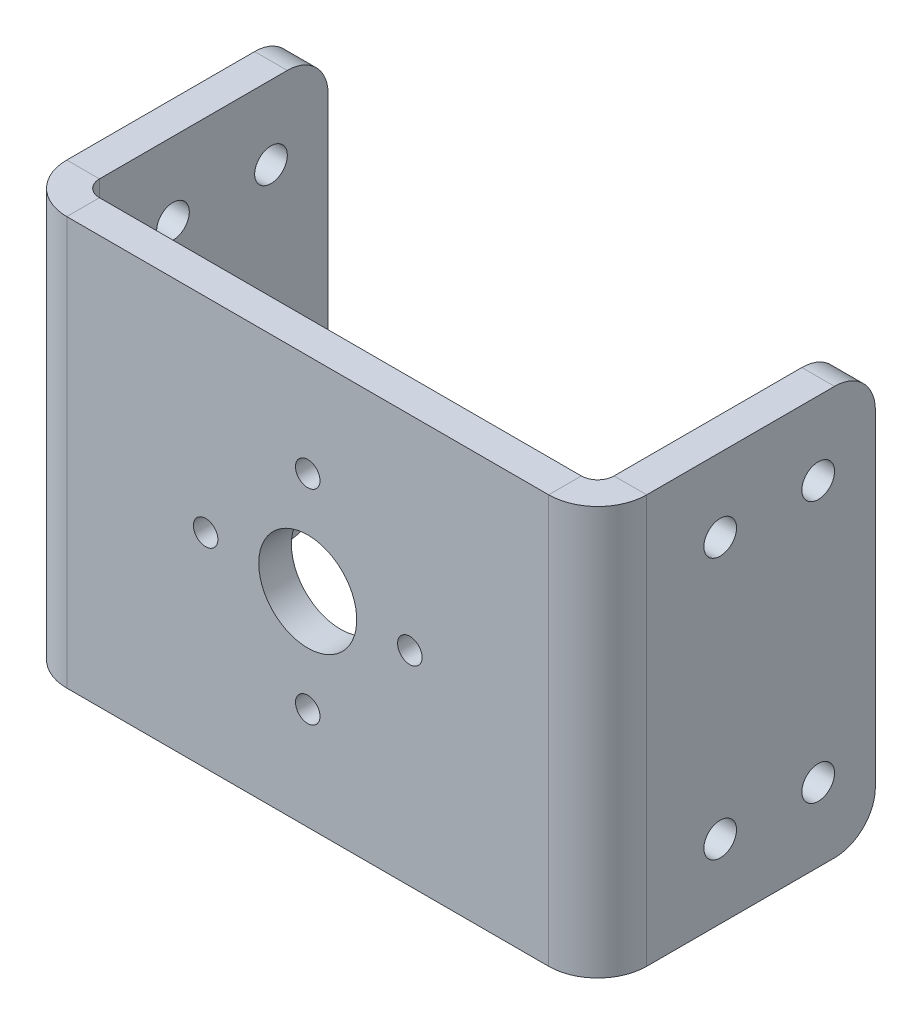
ISO-10303-21;
HEADER;
FILE_DESCRIPTION(('STEP AP214'),'2;1');
FILE_NAME('part.step','',(''),(''),'','','');
FILE_SCHEMA(('AUTOMOTIVE_DESIGN { 1 0 10303 214 1 1 1 1 }'));
ENDSEC;
DATA;
#1=APPLICATION_CONTEXT('core data for automotive mechanical design processes');
#2=APPLICATION_PROTOCOL_DEFINITION('international standard','automotive_design',2000,#1);
#3=PRODUCT_CONTEXT('',#1,'mechanical');
#4=PRODUCT('Part','Part','',(#3));
#5=PRODUCT_RELATED_PRODUCT_CATEGORY('part','',(#4));
#6=PRODUCT_DEFINITION_FORMATION('','',#4);
#7=PRODUCT_DEFINITION_CONTEXT('part definition',#1,'design');
#8=PRODUCT_DEFINITION('design','',#6,#7);
#9=PRODUCT_DEFINITION_SHAPE('','',#8);
#10=(LENGTH_UNIT() NAMED_UNIT(*) SI_UNIT(.MILLI.,.METRE.));
#11=(NAMED_UNIT(*) PLANE_ANGLE_UNIT() SI_UNIT($,.RADIAN.));
#12=(NAMED_UNIT(*) SI_UNIT($,.STERADIAN.) SOLID_ANGLE_UNIT());
#13=UNCERTAINTY_MEASURE_WITH_UNIT(LENGTH_MEASURE(1.E-05),#10,'distance_accuracy_value','');
#14=(GEOMETRIC_REPRESENTATION_CONTEXT(3) GLOBAL_UNCERTAINTY_ASSIGNED_CONTEXT((#13)) GLOBAL_UNIT_ASSIGNED_CONTEXT((#10,
#11,#12)) REPRESENTATION_CONTEXT('',''));
#15=CARTESIAN_POINT('',(0.,0.,0.));
#16=DIRECTION('',(0.,0.,1.));
#17=DIRECTION('',(1.,0.,0.));
#18=AXIS2_PLACEMENT_3D('',#15,#16,#17);
#19=CARTESIAN_POINT('',(-35.5,50.,-6.));
#20=DIRECTION('',(0.,1.,0.));
#21=DIRECTION('',(0.,0.,1.));
#22=AXIS2_PLACEMENT_3D('',#19,#20,#21);
#23=PLANE('',#22);
#24=DIRECTION('',(1.,0.,0.));
#25=VECTOR('',#24,1.);
#26=CARTESIAN_POINT('',(-35.5,50.,-6.));
#27=LINE('',#26,#25);
#28=CARTESIAN_POINT('',(-35.5,50.,-6.));
#29=VERTEX_POINT('',#28);
#30=CARTESIAN_POINT('',(-31.5,50.,-6.));
#31=VERTEX_POINT('',#30);
#32=EDGE_CURVE('E268',#29,#31,#27,.T.);
#33=ORIENTED_EDGE('',*,*,#32,.F.);
#34=CARTESIAN_POINT('',(-29.5,50.,-6.));
#35=DIRECTION('',(0.,1.,0.));
#36=DIRECTION('',(0.,0.,1.));
#37=AXIS2_PLACEMENT_3D('',#34,#35,#36);
#38=CIRCLE('',#37,6.);
#39=CARTESIAN_POINT('',(-29.5,50.,0.));
#40=VERTEX_POINT('',#39);
#41=EDGE_CURVE('E195',#29,#40,#38,.T.);
#42=ORIENTED_EDGE('',*,*,#41,.T.);
#43=DIRECTION('',(0.,0.,1.));
#44=VECTOR('',#43,1.);
#45=CARTESIAN_POINT('',(-29.5,50.,-4.));
#46=LINE('',#45,#44);
#47=CARTESIAN_POINT('',(-29.5,50.,-4.));
#48=VERTEX_POINT('',#47);
#49=EDGE_CURVE('E266',#48,#40,#46,.T.);
#50=ORIENTED_EDGE('',*,*,#49,.F.);
#51=CARTESIAN_POINT('',(-29.5,50.,-6.));
#52=DIRECTION('',(0.,1.,0.));
#53=DIRECTION('',(1.,0.,0.));
#54=AXIS2_PLACEMENT_3D('',#51,#52,#53);
#55=CIRCLE('',#54,2.);
#56=EDGE_CURVE('E185',#31,#48,#55,.T.);
#57=ORIENTED_EDGE('',*,*,#56,.F.);
#58=EDGE_LOOP('',(#33,#42,#50,#57));
#59=FACE_BOUND('',#58,.T.);
#60=ADVANCED_FACE('F36',(#59),#23,.T.);
#61=CARTESIAN_POINT('',(-29.5,50.,-4.));
#62=DIRECTION('',(0.,1.,0.));
#63=DIRECTION('',(0.,0.,1.));
#64=AXIS2_PLACEMENT_3D('',#61,#62,#63);
#65=PLANE('',#64);
#66=DIRECTION('',(0.,0.,-1.));
#67=VECTOR('',#66,1.);
#68=CARTESIAN_POINT('',(-31.5,50.,-6.));
#69=LINE('',#68,#67);
#70=CARTESIAN_POINT('',(-31.5,50.,-29.));
#71=VERTEX_POINT('',#70);
#72=EDGE_CURVE('E191',#71,#31,#69,.F.);
#73=ORIENTED_EDGE('',*,*,#72,.F.);
#74=DIRECTION('',(1.,0.,0.));
#75=VECTOR('',#74,1.);
#76=CARTESIAN_POINT('',(-29.5,50.,-29.));
#77=LINE('',#76,#75);
#78=CARTESIAN_POINT('',(-35.5,50.,-29.));
#79=VERTEX_POINT('',#78);
#80=EDGE_CURVE('E280',#71,#79,#77,.F.);
#81=ORIENTED_EDGE('',*,*,#80,.T.);
#82=DIRECTION('',(0.,0.,1.));
#83=VECTOR('',#82,1.);
#84=CARTESIAN_POINT('',(-35.5,50.,-6.));
#85=LINE('',#84,#83);
#86=EDGE_CURVE('E193',#79,#29,#85,.T.);
#87=ORIENTED_EDGE('',*,*,#86,.T.);
#88=ORIENTED_EDGE('',*,*,#32,.T.);
#89=EDGE_LOOP('',(#73,#81,#87,#88));
#90=FACE_BOUND('',#89,.T.);
#91=ADVANCED_FACE('F414',(#90),#65,.T.);
#92=CARTESIAN_POINT('',(-29.5,0.,0.));
#93=DIRECTION('',(0.,-1.,0.));
#94=DIRECTION('',(0.,0.,-1.));
#95=AXIS2_PLACEMENT_3D('',#92,#93,#94);
#96=PLANE('',#95);
#97=DIRECTION('',(0.,0.,-1.));
#98=VECTOR('',#97,1.);
#99=CARTESIAN_POINT('',(-29.5,0.,0.));
#100=LINE('',#99,#98);
#101=CARTESIAN_POINT('',(-29.5,0.,0.));
#102=VERTEX_POINT('',#101);
#103=CARTESIAN_POINT('',(-29.5,0.,-4.));
#104=VERTEX_POINT('',#103);
#105=EDGE_CURVE('E264',#102,#104,#100,.T.);
#106=ORIENTED_EDGE('',*,*,#105,.F.);
#107=CARTESIAN_POINT('',(-29.5,0.,-6.));
#108=DIRECTION('',(0.,1.,0.));
#109=DIRECTION('',(0.,0.,1.));
#110=AXIS2_PLACEMENT_3D('',#107,#108,#109);
#111=CIRCLE('',#110,6.);
#112=CARTESIAN_POINT('',(-35.5,0.,-6.));
#113=VERTEX_POINT('',#112);
#114=EDGE_CURVE('E220',#113,#102,#111,.T.);
#115=ORIENTED_EDGE('',*,*,#114,.F.);
#116=DIRECTION('',(-1.,0.,0.));
#117=VECTOR('',#116,1.);
#118=CARTESIAN_POINT('',(-31.5,0.,-6.));
#119=LINE('',#118,#117);
#120=CARTESIAN_POINT('',(-31.5,0.,-6.));
#121=VERTEX_POINT('',#120);
#122=EDGE_CURVE('E261',#121,#113,#119,.T.);
#123=ORIENTED_EDGE('',*,*,#122,.F.);
#124=CARTESIAN_POINT('',(-29.5,0.,-6.));
#125=DIRECTION('',(0.,1.,0.));
#126=DIRECTION('',(1.,0.,0.));
#127=AXIS2_PLACEMENT_3D('',#124,#125,#126);
#128=CIRCLE('',#127,2.);
#129=EDGE_CURVE('E213',#121,#104,#128,.T.);
#130=ORIENTED_EDGE('',*,*,#129,.T.);
#131=EDGE_LOOP('',(#106,#115,#123,#130));
#132=FACE_BOUND('',#131,.T.);
#133=ADVANCED_FACE('F420',(#132),#96,.T.);
#134=CARTESIAN_POINT('',(-31.5,0.,-6.));
#135=DIRECTION('',(0.,-1.,0.));
#136=DIRECTION('',(0.,0.,-1.));
#137=AXIS2_PLACEMENT_3D('',#134,#135,#136);
#138=PLANE('',#137);
#139=DIRECTION('',(1.,0.,0.));
#140=VECTOR('',#139,1.);
#141=CARTESIAN_POINT('',(-29.5,0.,0.));
#142=LINE('',#141,#140);
#143=CARTESIAN_POINT('',(29.5,0.,0.));
#144=VERTEX_POINT('',#143);
#145=EDGE_CURVE('E223',#102,#144,#142,.T.);
#146=ORIENTED_EDGE('',*,*,#145,.F.);
#147=ORIENTED_EDGE('',*,*,#105,.T.);
#148=DIRECTION('',(1.,0.,0.));
#149=VECTOR('',#148,1.);
#150=CARTESIAN_POINT('',(-29.5,0.,-4.));
#151=LINE('',#150,#149);
#152=CARTESIAN_POINT('',(29.5,0.,-4.00000000000001));
#153=VERTEX_POINT('',#152);
#154=EDGE_CURVE('E210',#104,#153,#151,.T.);
#155=ORIENTED_EDGE('',*,*,#154,.T.);
#156=DIRECTION('',(0.,0.,1.));
#157=VECTOR('',#156,1.);
#158=CARTESIAN_POINT('',(29.5,0.,-4.00000000000001));
#159=LINE('',#158,#157);
#160=EDGE_CURVE('E257',#153,#144,#159,.T.);
#161=ORIENTED_EDGE('',*,*,#160,.T.);
#162=EDGE_LOOP('',(#146,#147,#155,#161));
#163=FACE_BOUND('',#162,.T.);
#164=ADVANCED_FACE('F454',(#163),#138,.T.);
#165=CARTESIAN_POINT('',(29.5,50.,0.));
#166=DIRECTION('',(0.,1.,0.));
#167=DIRECTION('',(0.,0.,1.));
#168=AXIS2_PLACEMENT_3D('',#165,#166,#167);
#169=PLANE('',#168);
#170=DIRECTION('',(0.,0.,-1.));
#171=VECTOR('',#170,1.);
#172=CARTESIAN_POINT('',(29.5,50.,0.));
#173=LINE('',#172,#171);
#174=CARTESIAN_POINT('',(29.5,50.,0.));
#175=VERTEX_POINT('',#174);
#176=CARTESIAN_POINT('',(29.5,50.,-4.00000000000001));
#177=VERTEX_POINT('',#176);
#178=EDGE_CURVE('E162',#175,#177,#173,.T.);
#179=ORIENTED_EDGE('',*,*,#178,.F.);
#180=CARTESIAN_POINT('',(29.5,50.,-6.00000000000001));
#181=DIRECTION('',(0.,1.,0.));
#182=DIRECTION('',(0.,0.,-1.));
#183=AXIS2_PLACEMENT_3D('',#180,#181,#182);
#184=CIRCLE('',#183,6.);
#185=CARTESIAN_POINT('',(35.5,50.,-6.00000000000001));
#186=VERTEX_POINT('',#185);
#187=EDGE_CURVE('E160',#175,#186,#184,.T.);
#188=ORIENTED_EDGE('',*,*,#187,.T.);
#189=DIRECTION('',(1.,0.,0.));
#190=VECTOR('',#189,1.);
#191=CARTESIAN_POINT('',(31.5,50.,-6.00000000000001));
#192=LINE('',#191,#190);
#193=CARTESIAN_POINT('',(31.5,50.,-6.00000000000001));
#194=VERTEX_POINT('',#193);
#195=EDGE_CURVE('E153',#194,#186,#192,.T.);
#196=ORIENTED_EDGE('',*,*,#195,.F.);
#197=CARTESIAN_POINT('',(29.5,50.,-6.00000000000001));
#198=DIRECTION('',(0.,1.,0.));
#199=DIRECTION('',(1.,0.,0.));
#200=AXIS2_PLACEMENT_3D('',#197,#198,#199);
#201=CIRCLE('',#200,2.);
#202=EDGE_CURVE('E157',#177,#194,#201,.T.);
#203=ORIENTED_EDGE('',*,*,#202,.F.);
#204=EDGE_LOOP('',(#179,#188,#196,#203));
#205=FACE_BOUND('',#204,.T.);
#206=ADVANCED_FACE('F155',(#205),#169,.T.);
#207=CARTESIAN_POINT('',(31.5,50.,-6.00000000000001));
#208=DIRECTION('',(0.,1.,0.));
#209=DIRECTION('',(0.,0.,1.));
#210=AXIS2_PLACEMENT_3D('',#207,#208,#209);
#211=PLANE('',#210);
#212=DIRECTION('',(1.,0.,0.));
#213=VECTOR('',#212,1.);
#214=CARTESIAN_POINT('',(-29.5,50.,0.));
#215=LINE('',#214,#213);
#216=EDGE_CURVE('E198',#40,#175,#215,.T.);
#217=ORIENTED_EDGE('',*,*,#216,.T.);
#218=ORIENTED_EDGE('',*,*,#178,.T.);
#219=DIRECTION('',(1.,0.,0.));
#220=VECTOR('',#219,1.);
#221=CARTESIAN_POINT('',(-29.5,50.,-4.));
#222=LINE('',#221,#220);
#223=EDGE_CURVE('E183',#48,#177,#222,.T.);
#224=ORIENTED_EDGE('',*,*,#223,.F.);
#225=ORIENTED_EDGE('',*,*,#49,.T.);
#226=EDGE_LOOP('',(#217,#218,#224,#225));
#227=FACE_BOUND('',#226,.T.);
#228=ADVANCED_FACE('F471',(#227),#211,.T.);
#229=CARTESIAN_POINT('',(35.5,0.,-6.00000000000001));
#230=DIRECTION('',(0.,-1.,0.));
#231=DIRECTION('',(0.,0.,-1.));
#232=AXIS2_PLACEMENT_3D('',#229,#230,#231);
#233=PLANE('',#232);
#234=DIRECTION('',(-1.,0.,0.));
#235=VECTOR('',#234,1.);
#236=CARTESIAN_POINT('',(35.5,0.,-6.00000000000001));
#237=LINE('',#236,#235);
#238=CARTESIAN_POINT('',(35.5,0.,-6.00000000000001));
#239=VERTEX_POINT('',#238);
#240=CARTESIAN_POINT('',(31.5,0.,-6.00000000000001));
#241=VERTEX_POINT('',#240);
#242=EDGE_CURVE('E163',#239,#241,#237,.T.);
#243=ORIENTED_EDGE('',*,*,#242,.F.);
#244=CARTESIAN_POINT('',(29.5,0.,-6.00000000000001));
#245=DIRECTION('',(0.,1.,0.));
#246=DIRECTION('',(0.,0.,-1.));
#247=AXIS2_PLACEMENT_3D('',#244,#245,#246);
#248=CIRCLE('',#247,6.);
#249=EDGE_CURVE('E226',#144,#239,#248,.T.);
#250=ORIENTED_EDGE('',*,*,#249,.F.);
#251=ORIENTED_EDGE('',*,*,#160,.F.);
#252=CARTESIAN_POINT('',(29.5,0.,-6.00000000000001));
#253=DIRECTION('',(0.,1.,0.));
#254=DIRECTION('',(1.,0.,0.));
#255=AXIS2_PLACEMENT_3D('',#252,#253,#254);
#256=CIRCLE('',#255,2.);
#257=EDGE_CURVE('E208',#153,#241,#256,.T.);
#258=ORIENTED_EDGE('',*,*,#257,.T.);
#259=EDGE_LOOP('',(#243,#250,#251,#258));
#260=FACE_BOUND('',#259,.T.);
#261=ADVANCED_FACE('F450',(#260),#233,.T.);
#262=CARTESIAN_POINT('',(29.5,0.,-4.00000000000001));
#263=DIRECTION('',(0.,-1.,0.));
#264=DIRECTION('',(0.,0.,-1.));
#265=AXIS2_PLACEMENT_3D('',#262,#263,#264);
#266=PLANE('',#265);
#267=DIRECTION('',(0.,0.,-1.));
#268=VECTOR('',#267,1.);
#269=CARTESIAN_POINT('',(31.5,0.,-6.00000000000001));
#270=LINE('',#269,#268);
#271=CARTESIAN_POINT('',(31.5,0.,-29.));
#272=VERTEX_POINT('',#271);
#273=EDGE_CURVE('E170',#241,#272,#270,.T.);
#274=ORIENTED_EDGE('',*,*,#273,.T.);
#275=DIRECTION('',(1.,0.,0.));
#276=VECTOR('',#275,1.);
#277=CARTESIAN_POINT('',(29.5,0.,-29.));
#278=LINE('',#277,#276);
#279=CARTESIAN_POINT('',(35.5,0.,-29.));
#280=VERTEX_POINT('',#279);
#281=EDGE_CURVE('E11',#272,#280,#278,.T.);
#282=ORIENTED_EDGE('',*,*,#281,.T.);
#283=DIRECTION('',(0.,0.,-1.));
#284=VECTOR('',#283,1.);
#285=CARTESIAN_POINT('',(35.5,0.,-6.00000000000001));
#286=LINE('',#285,#284);
#287=EDGE_CURVE('E203',#239,#280,#286,.T.);
#288=ORIENTED_EDGE('',*,*,#287,.F.);
#289=ORIENTED_EDGE('',*,*,#242,.T.);
#290=EDGE_LOOP('',(#274,#282,#288,#289));
#291=FACE_BOUND('',#290,.T.);
#292=ADVANCED_FACE('F444',(#291),#266,.T.);
#293=CARTESIAN_POINT('',(35.5,50.,-6.00000000000001));
#294=DIRECTION('',(-1.,0.,0.));
#295=DIRECTION('',(0.,0.,1.));
#296=AXIS2_PLACEMENT_3D('',#293,#294,#295);
#297=PLANE('',#296);
#298=CARTESIAN_POINT('',(35.5,9.,-27.));
#299=DIRECTION('',(1.,0.,0.));
#300=DIRECTION('',(0.,0.,1.));
#301=AXIS2_PLACEMENT_3D('',#298,#299,#300);
#302=CIRCLE('',#301,2.);
#303=CARTESIAN_POINT('',(35.5,9.,-25.));
#304=VERTEX_POINT('',#303);
#305=EDGE_CURVE('E371',#304,#304,#302,.T.);
#306=ORIENTED_EDGE('',*,*,#305,.F.);
#307=EDGE_LOOP('',(#306));
#308=FACE_BOUND('',#307,.T.);
#309=CARTESIAN_POINT('',(35.5,41.,-15.));
#310=DIRECTION('',(1.,0.,0.));
#311=DIRECTION('',(0.,0.,1.));
#312=AXIS2_PLACEMENT_3D('',#309,#310,#311);
#313=CIRCLE('',#312,2.);
#314=CARTESIAN_POINT('',(35.5,41.,-13.));
#315=VERTEX_POINT('',#314);
#316=EDGE_CURVE('E377',#315,#315,#313,.T.);
#317=ORIENTED_EDGE('',*,*,#316,.F.);
#318=EDGE_LOOP('',(#317));
#319=FACE_BOUND('',#318,.T.);
#320=CARTESIAN_POINT('',(35.5,41.,-27.));
#321=DIRECTION('',(1.,0.,0.));
#322=DIRECTION('',(0.,0.,-1.));
#323=AXIS2_PLACEMENT_3D('',#320,#321,#322);
#324=CIRCLE('',#323,2.);
#325=CARTESIAN_POINT('',(35.5,41.,-29.));
#326=VERTEX_POINT('',#325);
#327=EDGE_CURVE('E383',#326,#326,#324,.T.);
#328=ORIENTED_EDGE('',*,*,#327,.F.);
#329=EDGE_LOOP('',(#328));
#330=FACE_BOUND('',#329,.T.);
#331=CARTESIAN_POINT('',(35.5,9.,-15.));
#332=DIRECTION('',(1.,0.,0.));
#333=DIRECTION('',(0.,0.,-1.));
#334=AXIS2_PLACEMENT_3D('',#331,#332,#333);
#335=CIRCLE('',#334,2.00000000000001);
#336=CARTESIAN_POINT('',(35.5,9.,-17.));
#337=VERTEX_POINT('',#336);
#338=EDGE_CURVE('E365',#337,#337,#335,.T.);
#339=ORIENTED_EDGE('',*,*,#338,.F.);
#340=EDGE_LOOP('',(#339));
#341=FACE_BOUND('',#340,.T.);
#342=DIRECTION('',(0.,-1.,0.));
#343=VECTOR('',#342,1.);
#344=CARTESIAN_POINT('',(35.5,50.,-34.));
#345=LINE('',#344,#343);
#346=CARTESIAN_POINT('',(35.5,45.,-34.));
#347=VERTEX_POINT('',#346);
#348=CARTESIAN_POINT('',(35.5,5.,-34.));
#349=VERTEX_POINT('',#348);
#350=EDGE_CURVE('E254',#347,#349,#345,.T.);
#351=ORIENTED_EDGE('',*,*,#350,.F.);
#352=CARTESIAN_POINT('',(35.5,45.,-29.));
#353=DIRECTION('',(-1.,0.,0.));
#354=DIRECTION('',(0.,0.,1.));
#355=AXIS2_PLACEMENT_3D('',#352,#353,#354);
#356=CIRCLE('',#355,5.);
#357=CARTESIAN_POINT('',(35.5,50.,-29.));
#358=VERTEX_POINT('',#357);
#359=EDGE_CURVE('E296',#347,#358,#356,.F.);
#360=ORIENTED_EDGE('',*,*,#359,.T.);
#361=DIRECTION('',(0.,0.,-1.));
#362=VECTOR('',#361,1.);
#363=CARTESIAN_POINT('',(35.5,50.,-6.00000000000001));
#364=LINE('',#363,#362);
#365=EDGE_CURVE('E178',#186,#358,#364,.T.);
#366=ORIENTED_EDGE('',*,*,#365,.F.);
#367=DIRECTION('',(0.,-1.,0.));
#368=VECTOR('',#367,1.);
#369=CARTESIAN_POINT('',(35.5,50.,-6.00000000000001));
#370=LINE('',#369,#368);
#371=EDGE_CURVE('E202',#186,#239,#370,.T.);
#372=ORIENTED_EDGE('',*,*,#371,.T.);
#373=ORIENTED_EDGE('',*,*,#287,.T.);
#374=CARTESIAN_POINT('',(35.5,5.,-29.));
#375=DIRECTION('',(-1.,0.,0.));
#376=DIRECTION('',(0.,0.,1.));
#377=AXIS2_PLACEMENT_3D('',#374,#375,#376);
#378=CIRCLE('',#377,5.);
#379=EDGE_CURVE('E294',#280,#349,#378,.F.);
#380=ORIENTED_EDGE('',*,*,#379,.T.);
#381=EDGE_LOOP('',(#351,#360,#366,#372,#373,#380));
#382=FACE_BOUND('',#381,.T.);
#383=ADVANCED_FACE('F309',(#308,#319,#330,#341,#382),#297,.F.);
#384=CARTESIAN_POINT('',(31.5,50.,-34.));
#385=DIRECTION('',(0.,0.,-1.));
#386=DIRECTION('',(-1.,0.,0.));
#387=AXIS2_PLACEMENT_3D('',#384,#385,#386);
#388=PLANE('',#387);
#389=DIRECTION('',(0.,-1.,0.));
#390=VECTOR('',#389,1.);
#391=CARTESIAN_POINT('',(31.5,50.,-34.));
#392=LINE('',#391,#390);
#393=CARTESIAN_POINT('',(31.5,45.,-34.));
#394=VERTEX_POINT('',#393);
#395=CARTESIAN_POINT('',(31.5,5.,-34.));
#396=VERTEX_POINT('',#395);
#397=EDGE_CURVE('E174',#394,#396,#392,.T.);
#398=ORIENTED_EDGE('',*,*,#397,.F.);
#399=DIRECTION('',(1.,0.,0.));
#400=VECTOR('',#399,1.);
#401=CARTESIAN_POINT('',(31.5,45.,-34.));
#402=LINE('',#401,#400);
#403=EDGE_CURVE('E291',#394,#347,#402,.T.);
#404=ORIENTED_EDGE('',*,*,#403,.T.);
#405=ORIENTED_EDGE('',*,*,#350,.T.);
#406=DIRECTION('',(1.,0.,0.));
#407=VECTOR('',#406,1.);
#408=CARTESIAN_POINT('',(31.5,5.,-34.));
#409=LINE('',#408,#407);
#410=EDGE_CURVE('E289',#349,#396,#409,.F.);
#411=ORIENTED_EDGE('',*,*,#410,.T.);
#412=EDGE_LOOP('',(#398,#404,#405,#411));
#413=FACE_BOUND('',#412,.T.);
#414=ADVANCED_FACE('F303',(#413),#388,.T.);
#415=CARTESIAN_POINT('',(31.5,50.,-6.00000000000001));
#416=DIRECTION('',(-1.,0.,0.));
#417=DIRECTION('',(0.,0.,1.));
#418=AXIS2_PLACEMENT_3D('',#415,#416,#417);
#419=PLANE('',#418);
#420=CARTESIAN_POINT('',(31.5,9.,-27.));
#421=DIRECTION('',(-1.,0.,0.));
#422=DIRECTION('',(0.,0.,1.));
#423=AXIS2_PLACEMENT_3D('',#420,#421,#422);
#424=CIRCLE('',#423,2.);
#425=CARTESIAN_POINT('',(31.5,9.,-25.));
#426=VERTEX_POINT('',#425);
#427=EDGE_CURVE('E333',#426,#426,#424,.T.);
#428=ORIENTED_EDGE('',*,*,#427,.F.);
#429=EDGE_LOOP('',(#428));
#430=FACE_BOUND('',#429,.T.);
#431=CARTESIAN_POINT('',(31.5,41.,-15.));
#432=DIRECTION('',(-1.,0.,0.));
#433=DIRECTION('',(0.,0.,1.));
#434=AXIS2_PLACEMENT_3D('',#431,#432,#433);
#435=CIRCLE('',#434,2.);
#436=CARTESIAN_POINT('',(31.5,41.,-13.));
#437=VERTEX_POINT('',#436);
#438=EDGE_CURVE('E346',#437,#437,#435,.T.);
#439=ORIENTED_EDGE('',*,*,#438,.F.);
#440=EDGE_LOOP('',(#439));
#441=FACE_BOUND('',#440,.T.);
#442=CARTESIAN_POINT('',(31.5,41.,-27.));
#443=DIRECTION('',(-1.,0.,0.));
#444=DIRECTION('',(0.,0.,1.));
#445=AXIS2_PLACEMENT_3D('',#442,#443,#444);
#446=CIRCLE('',#445,2.);
#447=CARTESIAN_POINT('',(31.5,41.,-25.));
#448=VERTEX_POINT('',#447);
#449=EDGE_CURVE('E352',#448,#448,#446,.T.);
#450=ORIENTED_EDGE('',*,*,#449,.F.);
#451=EDGE_LOOP('',(#450));
#452=FACE_BOUND('',#451,.T.);
#453=CARTESIAN_POINT('',(31.5,9.,-15.));
#454=DIRECTION('',(-1.,0.,0.));
#455=DIRECTION('',(0.,0.,1.));
#456=AXIS2_PLACEMENT_3D('',#453,#454,#455);
#457=CIRCLE('',#456,2.00000000000001);
#458=CARTESIAN_POINT('',(31.5,9.,-13.));
#459=VERTEX_POINT('',#458);
#460=EDGE_CURVE('E358',#459,#459,#457,.T.);
#461=ORIENTED_EDGE('',*,*,#460,.F.);
#462=EDGE_LOOP('',(#461));
#463=FACE_BOUND('',#462,.T.);
#464=DIRECTION('',(0.,0.,-1.));
#465=VECTOR('',#464,1.);
#466=CARTESIAN_POINT('',(31.5,50.,-6.00000000000001));
#467=LINE('',#466,#465);
#468=CARTESIAN_POINT('',(31.5,50.,-29.));
#469=VERTEX_POINT('',#468);
#470=EDGE_CURVE('E168',#194,#469,#467,.T.);
#471=ORIENTED_EDGE('',*,*,#470,.T.);
#472=CARTESIAN_POINT('',(31.5,45.,-29.));
#473=DIRECTION('',(-1.,0.,0.));
#474=DIRECTION('',(0.,0.,1.));
#475=AXIS2_PLACEMENT_3D('',#472,#473,#474);
#476=CIRCLE('',#475,5.);
#477=EDGE_CURVE('E44',#469,#394,#476,.T.);
#478=ORIENTED_EDGE('',*,*,#477,.T.);
#479=ORIENTED_EDGE('',*,*,#397,.T.);
#480=CARTESIAN_POINT('',(31.5,5.,-29.));
#481=DIRECTION('',(-1.,0.,0.));
#482=DIRECTION('',(0.,0.,1.));
#483=AXIS2_PLACEMENT_3D('',#480,#481,#482);
#484=CIRCLE('',#483,5.);
#485=EDGE_CURVE('E51',#396,#272,#484,.T.);
#486=ORIENTED_EDGE('',*,*,#485,.T.);
#487=ORIENTED_EDGE('',*,*,#273,.F.);
#488=DIRECTION('',(0.,-1.,0.));
#489=VECTOR('',#488,1.);
#490=CARTESIAN_POINT('',(31.5,50.,-6.00000000000001));
#491=LINE('',#490,#489);
#492=EDGE_CURVE('E166',#194,#241,#491,.T.);
#493=ORIENTED_EDGE('',*,*,#492,.F.);
#494=EDGE_LOOP('',(#471,#478,#479,#486,#487,#493));
#495=FACE_BOUND('',#494,.T.);
#496=ADVANCED_FACE('F167',(#430,#441,#452,#463,#495),#419,.T.);
#497=CARTESIAN_POINT('',(29.5,50.,-6.00000000000001));
#498=DIRECTION('',(0.,-1.,0.));
#499=DIRECTION('',(0.,0.,-1.));
#500=AXIS2_PLACEMENT_3D('',#497,#498,#499);
#501=CYLINDRICAL_SURFACE('',#500,2.);
#502=ORIENTED_EDGE('',*,*,#257,.F.);
#503=DIRECTION('',(0.,-1.,0.));
#504=VECTOR('',#503,1.);
#505=CARTESIAN_POINT('',(29.5,50.,-4.00000000000001));
#506=LINE('',#505,#504);
#507=EDGE_CURVE('E175',#177,#153,#506,.T.);
#508=ORIENTED_EDGE('',*,*,#507,.F.);
#509=ORIENTED_EDGE('',*,*,#202,.T.);
#510=ORIENTED_EDGE('',*,*,#492,.T.);
#511=EDGE_LOOP('',(#502,#508,#509,#510));
#512=FACE_BOUND('',#511,.T.);
#513=ADVANCED_FACE('F181',(#512),#501,.F.);
#514=CARTESIAN_POINT('',(-29.5,50.,-4.));
#515=DIRECTION('',(0.,0.,-1.));
#516=DIRECTION('',(-1.,0.,0.));
#517=AXIS2_PLACEMENT_3D('',#514,#515,#516);
#518=PLANE('',#517);
#519=CARTESIAN_POINT('',(0.,37.5,-4.));
#520=DIRECTION('',(0.,0.,-1.));
#521=DIRECTION('',(-1.,0.,0.));
#522=AXIS2_PLACEMENT_3D('',#519,#520,#521);
#523=CIRCLE('',#522,1.5);
#524=CARTESIAN_POINT('',(-1.5,37.5,-4.));
#525=VERTEX_POINT('',#524);
#526=EDGE_CURVE('E324',#525,#525,#523,.T.);
#527=ORIENTED_EDGE('',*,*,#526,.F.);
#528=EDGE_LOOP('',(#527));
#529=FACE_BOUND('',#528,.T.);
#530=CARTESIAN_POINT('',(-12.5000000000002,25.0000000000001,-4.));
#531=DIRECTION('',(0.,0.,-1.));
#532=DIRECTION('',(-1.,0.,0.));
#533=AXIS2_PLACEMENT_3D('',#530,#531,#532);
#534=CIRCLE('',#533,1.5);
#535=CARTESIAN_POINT('',(-14.0000000000002,25.0000000000001,-4.));
#536=VERTEX_POINT('',#535);
#537=EDGE_CURVE('E317',#536,#536,#534,.T.);
#538=ORIENTED_EDGE('',*,*,#537,.F.);
#539=EDGE_LOOP('',(#538));
#540=FACE_BOUND('',#539,.T.);
#541=CARTESIAN_POINT('',(-2.62350959132894E-13,12.5,-4.));
#542=DIRECTION('',(0.,0.,-1.));
#543=DIRECTION('',(-1.,0.,0.));
#544=AXIS2_PLACEMENT_3D('',#541,#542,#543);
#545=CIRCLE('',#544,1.5);
#546=CARTESIAN_POINT('',(-1.50000000000026,12.5,-4.));
#547=VERTEX_POINT('',#546);
#548=EDGE_CURVE('E336',#547,#547,#545,.T.);
#549=ORIENTED_EDGE('',*,*,#548,.F.);
#550=EDGE_LOOP('',(#549));
#551=FACE_BOUND('',#550,.T.);
#552=CARTESIAN_POINT('',(12.4999999999998,25.,-4.00000000000001));
#553=DIRECTION('',(0.,0.,-1.));
#554=DIRECTION('',(-1.,0.,0.));
#555=AXIS2_PLACEMENT_3D('',#552,#553,#554);
#556=CIRCLE('',#555,1.5);
#557=CARTESIAN_POINT('',(10.9999999999998,25.,-4.00000000000001));
#558=VERTEX_POINT('',#557);
#559=EDGE_CURVE('E329',#558,#558,#556,.T.);
#560=ORIENTED_EDGE('',*,*,#559,.F.);
#561=EDGE_LOOP('',(#560));
#562=FACE_BOUND('',#561,.T.);
#563=CARTESIAN_POINT('',(0.,25.,-4.));
#564=DIRECTION('',(0.,0.,-1.));
#565=DIRECTION('',(-1.,0.,0.));
#566=AXIS2_PLACEMENT_3D('',#563,#564,#565);
#567=CIRCLE('',#566,6.);
#568=CARTESIAN_POINT('',(-6.,25.,-4.));
#569=VERTEX_POINT('',#568);
#570=EDGE_CURVE('E311',#569,#569,#567,.T.);
#571=ORIENTED_EDGE('',*,*,#570,.F.);
#572=EDGE_LOOP('',(#571));
#573=FACE_BOUND('',#572,.T.);
#574=ORIENTED_EDGE('',*,*,#154,.F.);
#575=DIRECTION('',(0.,-1.,0.));
#576=VECTOR('',#575,1.);
#577=CARTESIAN_POINT('',(-29.5,50.,-4.));
#578=LINE('',#577,#576);
#579=EDGE_CURVE('E249',#48,#104,#578,.T.);
#580=ORIENTED_EDGE('',*,*,#579,.F.);
#581=ORIENTED_EDGE('',*,*,#223,.T.);
#582=ORIENTED_EDGE('',*,*,#507,.T.);
#583=EDGE_LOOP('',(#574,#580,#581,#582));
#584=FACE_BOUND('',#583,.T.);
#585=ADVANCED_FACE('F457',(#529,#540,#551,#562,#573,#584),#518,.T.);
#586=CARTESIAN_POINT('',(-29.5,50.,-6.));
#587=DIRECTION('',(0.,-1.,0.));
#588=DIRECTION('',(0.,0.,-1.));
#589=AXIS2_PLACEMENT_3D('',#586,#587,#588);
#590=CYLINDRICAL_SURFACE('',#589,2.);
#591=ORIENTED_EDGE('',*,*,#129,.F.);
#592=DIRECTION('',(0.,-1.,0.));
#593=VECTOR('',#592,1.);
#594=CARTESIAN_POINT('',(-31.5,50.,-6.));
#595=LINE('',#594,#593);
#596=EDGE_CURVE('E246',#31,#121,#595,.T.);
#597=ORIENTED_EDGE('',*,*,#596,.F.);
#598=ORIENTED_EDGE('',*,*,#56,.T.);
#599=ORIENTED_EDGE('',*,*,#579,.T.);
#600=EDGE_LOOP('',(#591,#597,#598,#599));
#601=FACE_BOUND('',#600,.T.);
#602=ADVANCED_FACE('F465',(#601),#590,.F.);
#603=CARTESIAN_POINT('',(-31.5,50.,-6.));
#604=DIRECTION('',(1.,0.,0.));
#605=DIRECTION('',(0.,0.,-1.));
#606=AXIS2_PLACEMENT_3D('',#603,#604,#605);
#607=PLANE('',#606);
#608=CARTESIAN_POINT('',(-31.5,9.,-27.));
#609=DIRECTION('',(1.,0.,0.));
#610=DIRECTION('',(0.,0.,-1.));
#611=AXIS2_PLACEMENT_3D('',#608,#609,#610);
#612=CIRCLE('',#611,2.);
#613=CARTESIAN_POINT('',(-31.5,9.,-29.));
#614=VERTEX_POINT('',#613);
#615=EDGE_CURVE('E343',#614,#614,#612,.T.);
#616=ORIENTED_EDGE('',*,*,#615,.F.);
#617=EDGE_LOOP('',(#616));
#618=FACE_BOUND('',#617,.T.);
#619=CARTESIAN_POINT('',(-31.5,41.,-15.));
#620=DIRECTION('',(1.,0.,0.));
#621=DIRECTION('',(0.,0.,-1.));
#622=AXIS2_PLACEMENT_3D('',#619,#620,#621);
#623=CIRCLE('',#622,2.);
#624=CARTESIAN_POINT('',(-31.5,41.,-17.));
#625=VERTEX_POINT('',#624);
#626=EDGE_CURVE('E349',#625,#625,#623,.T.);
#627=ORIENTED_EDGE('',*,*,#626,.F.);
#628=EDGE_LOOP('',(#627));
#629=FACE_BOUND('',#628,.T.);
#630=CARTESIAN_POINT('',(-31.5,41.,-27.));
#631=DIRECTION('',(1.,0.,0.));
#632=DIRECTION('',(0.,0.,-1.));
#633=AXIS2_PLACEMENT_3D('',#630,#631,#632);
#634=CIRCLE('',#633,2.);
#635=CARTESIAN_POINT('',(-31.5,41.,-29.));
#636=VERTEX_POINT('',#635);
#637=EDGE_CURVE('E355',#636,#636,#634,.T.);
#638=ORIENTED_EDGE('',*,*,#637,.F.);
#639=EDGE_LOOP('',(#638));
#640=FACE_BOUND('',#639,.T.);
#641=CARTESIAN_POINT('',(-31.5,9.,-15.));
#642=DIRECTION('',(1.,0.,0.));
#643=DIRECTION('',(0.,0.,-1.));
#644=AXIS2_PLACEMENT_3D('',#641,#642,#643);
#645=CIRCLE('',#644,2.00000000000001);
#646=CARTESIAN_POINT('',(-31.5,9.,-17.));
#647=VERTEX_POINT('',#646);
#648=EDGE_CURVE('E361',#647,#647,#645,.T.);
#649=ORIENTED_EDGE('',*,*,#648,.F.);
#650=EDGE_LOOP('',(#649));
#651=FACE_BOUND('',#650,.T.);
#652=DIRECTION('',(0.,-1.,0.));
#653=VECTOR('',#652,1.);
#654=CARTESIAN_POINT('',(-31.5,50.,-34.));
#655=LINE('',#654,#653);
#656=CARTESIAN_POINT('',(-31.5,45.,-34.));
#657=VERTEX_POINT('',#656);
#658=CARTESIAN_POINT('',(-31.5,5.,-34.));
#659=VERTEX_POINT('',#658);
#660=EDGE_CURVE('E243',#657,#659,#655,.T.);
#661=ORIENTED_EDGE('',*,*,#660,.F.);
#662=CARTESIAN_POINT('',(-31.5,45.,-29.));
#663=DIRECTION('',(1.,0.,0.));
#664=DIRECTION('',(0.,0.,-1.));
#665=AXIS2_PLACEMENT_3D('',#662,#663,#664);
#666=CIRCLE('',#665,5.);
#667=EDGE_CURVE('E278',#657,#71,#666,.T.);
#668=ORIENTED_EDGE('',*,*,#667,.T.);
#669=ORIENTED_EDGE('',*,*,#72,.T.);
#670=ORIENTED_EDGE('',*,*,#596,.T.);
#671=DIRECTION('',(0.,0.,-1.));
#672=VECTOR('',#671,1.);
#673=CARTESIAN_POINT('',(-31.5,0.,-6.));
#674=LINE('',#673,#672);
#675=CARTESIAN_POINT('',(-31.5,0.,-29.));
#676=VERTEX_POINT('',#675);
#677=EDGE_CURVE('E216',#676,#121,#674,.F.);
#678=ORIENTED_EDGE('',*,*,#677,.F.);
#679=CARTESIAN_POINT('',(-31.5,5.,-29.));
#680=DIRECTION('',(1.,0.,0.));
#681=DIRECTION('',(0.,0.,-1.));
#682=AXIS2_PLACEMENT_3D('',#679,#680,#681);
#683=CIRCLE('',#682,5.);
#684=EDGE_CURVE('E276',#676,#659,#683,.T.);
#685=ORIENTED_EDGE('',*,*,#684,.T.);
#686=EDGE_LOOP('',(#661,#668,#669,#670,#678,#685));
#687=FACE_BOUND('',#686,.T.);
#688=ADVANCED_FACE('F488',(#618,#629,#640,#651,#687),#607,.T.);
#689=CARTESIAN_POINT('',(-35.5,50.,-34.));
#690=DIRECTION('',(0.,0.,-1.));
#691=DIRECTION('',(-1.,0.,0.));
#692=AXIS2_PLACEMENT_3D('',#689,#690,#691);
#693=PLANE('',#692);
#694=DIRECTION('',(0.,-1.,0.));
#695=VECTOR('',#694,1.);
#696=CARTESIAN_POINT('',(-35.5,50.,-34.));
#697=LINE('',#696,#695);
#698=CARTESIAN_POINT('',(-35.5,45.,-34.));
#699=VERTEX_POINT('',#698);
#700=CARTESIAN_POINT('',(-35.5,5.,-34.));
#701=VERTEX_POINT('',#700);
#702=EDGE_CURVE('E240',#699,#701,#697,.T.);
#703=ORIENTED_EDGE('',*,*,#702,.F.);
#704=DIRECTION('',(1.,0.,0.));
#705=VECTOR('',#704,1.);
#706=CARTESIAN_POINT('',(-35.5,45.,-34.));
#707=LINE('',#706,#705);
#708=EDGE_CURVE('E273',#699,#657,#707,.T.);
#709=ORIENTED_EDGE('',*,*,#708,.T.);
#710=ORIENTED_EDGE('',*,*,#660,.T.);
#711=DIRECTION('',(1.,0.,0.));
#712=VECTOR('',#711,1.);
#713=CARTESIAN_POINT('',(-35.5,5.,-34.));
#714=LINE('',#713,#712);
#715=EDGE_CURVE('E271',#659,#701,#714,.F.);
#716=ORIENTED_EDGE('',*,*,#715,.T.);
#717=EDGE_LOOP('',(#703,#709,#710,#716));
#718=FACE_BOUND('',#717,.T.);
#719=ADVANCED_FACE('F494',(#718),#693,.T.);
#720=CARTESIAN_POINT('',(-35.5,50.,-6.));
#721=DIRECTION('',(1.,0.,0.));
#722=DIRECTION('',(0.,0.,-1.));
#723=AXIS2_PLACEMENT_3D('',#720,#721,#722);
#724=PLANE('',#723);
#725=CARTESIAN_POINT('',(-35.5,9.,-27.));
#726=DIRECTION('',(1.,0.,0.));
#727=DIRECTION('',(0.,0.,1.));
#728=AXIS2_PLACEMENT_3D('',#725,#726,#727);
#729=CIRCLE('',#728,2.);
#730=CARTESIAN_POINT('',(-35.5,9.,-25.));
#731=VERTEX_POINT('',#730);
#732=EDGE_CURVE('E374',#731,#731,#729,.T.);
#733=ORIENTED_EDGE('',*,*,#732,.T.);
#734=EDGE_LOOP('',(#733));
#735=FACE_BOUND('',#734,.T.);
#736=CARTESIAN_POINT('',(-35.5,41.,-15.));
#737=DIRECTION('',(1.,0.,0.));
#738=DIRECTION('',(0.,0.,1.));
#739=AXIS2_PLACEMENT_3D('',#736,#737,#738);
#740=CIRCLE('',#739,2.);
#741=CARTESIAN_POINT('',(-35.5,41.,-13.));
#742=VERTEX_POINT('',#741);
#743=EDGE_CURVE('E380',#742,#742,#740,.T.);
#744=ORIENTED_EDGE('',*,*,#743,.T.);
#745=EDGE_LOOP('',(#744));
#746=FACE_BOUND('',#745,.T.);
#747=CARTESIAN_POINT('',(-35.5,41.,-27.));
#748=DIRECTION('',(1.,0.,0.));
#749=DIRECTION('',(0.,0.,-1.));
#750=AXIS2_PLACEMENT_3D('',#747,#748,#749);
#751=CIRCLE('',#750,2.);
#752=CARTESIAN_POINT('',(-35.5,41.,-29.));
#753=VERTEX_POINT('',#752);
#754=EDGE_CURVE('E368',#753,#753,#751,.T.);
#755=ORIENTED_EDGE('',*,*,#754,.T.);
#756=EDGE_LOOP('',(#755));
#757=FACE_BOUND('',#756,.T.);
#758=CARTESIAN_POINT('',(-35.5,9.,-15.));
#759=DIRECTION('',(1.,0.,0.));
#760=DIRECTION('',(0.,0.,-1.));
#761=AXIS2_PLACEMENT_3D('',#758,#759,#760);
#762=CIRCLE('',#761,2.00000000000001);
#763=CARTESIAN_POINT('',(-35.5,9.,-17.));
#764=VERTEX_POINT('',#763);
#765=EDGE_CURVE('E364',#764,#764,#762,.T.);
#766=ORIENTED_EDGE('',*,*,#765,.T.);
#767=EDGE_LOOP('',(#766));
#768=FACE_BOUND('',#767,.T.);
#769=ORIENTED_EDGE('',*,*,#86,.F.);
#770=CARTESIAN_POINT('',(-35.5,45.,-29.));
#771=DIRECTION('',(1.,0.,0.));
#772=DIRECTION('',(0.,0.,-1.));
#773=AXIS2_PLACEMENT_3D('',#770,#771,#772);
#774=CIRCLE('',#773,5.);
#775=EDGE_CURVE('E284',#79,#699,#774,.F.);
#776=ORIENTED_EDGE('',*,*,#775,.T.);
#777=ORIENTED_EDGE('',*,*,#702,.T.);
#778=CARTESIAN_POINT('',(-35.5,5.,-29.));
#779=DIRECTION('',(1.,0.,0.));
#780=DIRECTION('',(0.,0.,-1.));
#781=AXIS2_PLACEMENT_3D('',#778,#779,#780);
#782=CIRCLE('',#781,5.);
#783=CARTESIAN_POINT('',(-35.5,0.,-29.));
#784=VERTEX_POINT('',#783);
#785=EDGE_CURVE('E282',#701,#784,#782,.F.);
#786=ORIENTED_EDGE('',*,*,#785,.T.);
#787=DIRECTION('',(0.,0.,1.));
#788=VECTOR('',#787,1.);
#789=CARTESIAN_POINT('',(-35.5,0.,-6.));
#790=LINE('',#789,#788);
#791=EDGE_CURVE('E218',#784,#113,#790,.T.);
#792=ORIENTED_EDGE('',*,*,#791,.T.);
#793=DIRECTION('',(0.,-1.,0.));
#794=VECTOR('',#793,1.);
#795=CARTESIAN_POINT('',(-35.5,50.,-6.));
#796=LINE('',#795,#794);
#797=EDGE_CURVE('E237',#29,#113,#796,.T.);
#798=ORIENTED_EDGE('',*,*,#797,.F.);
#799=EDGE_LOOP('',(#769,#776,#777,#786,#792,#798));
#800=FACE_BOUND('',#799,.T.);
#801=ADVANCED_FACE('F389',(#735,#746,#757,#768,#800),#724,.F.);
#802=CARTESIAN_POINT('',(-29.5,50.,-6.));
#803=DIRECTION('',(0.,-1.,0.));
#804=DIRECTION('',(0.,0.,-1.));
#805=AXIS2_PLACEMENT_3D('',#802,#803,#804);
#806=CYLINDRICAL_SURFACE('',#805,6.);
#807=ORIENTED_EDGE('',*,*,#114,.T.);
#808=DIRECTION('',(0.,-1.,0.));
#809=VECTOR('',#808,1.);
#810=CARTESIAN_POINT('',(-29.5,50.,0.));
#811=LINE('',#810,#809);
#812=EDGE_CURVE('E234',#40,#102,#811,.T.);
#813=ORIENTED_EDGE('',*,*,#812,.F.);
#814=ORIENTED_EDGE('',*,*,#41,.F.);
#815=ORIENTED_EDGE('',*,*,#797,.T.);
#816=EDGE_LOOP('',(#807,#813,#814,#815));
#817=FACE_BOUND('',#816,.T.);
#818=ADVANCED_FACE('F476',(#817),#806,.T.);
#819=CARTESIAN_POINT('',(-29.5,50.,0.));
#820=DIRECTION('',(0.,0.,-1.));
#821=DIRECTION('',(-1.,0.,0.));
#822=AXIS2_PLACEMENT_3D('',#819,#820,#821);
#823=PLANE('',#822);
#824=CARTESIAN_POINT('',(0.,37.5,0.));
#825=DIRECTION('',(0.,0.,-1.));
#826=DIRECTION('',(-1.,0.,0.));
#827=AXIS2_PLACEMENT_3D('',#824,#825,#826);
#828=CIRCLE('',#827,1.5);
#829=CARTESIAN_POINT('',(-1.5,37.5,0.));
#830=VERTEX_POINT('',#829);
#831=EDGE_CURVE('E314',#830,#830,#828,.T.);
#832=ORIENTED_EDGE('',*,*,#831,.T.);
#833=EDGE_LOOP('',(#832));
#834=FACE_BOUND('',#833,.T.);
#835=CARTESIAN_POINT('',(-12.5000000000002,25.0000000000001,0.));
#836=DIRECTION('',(0.,0.,-1.));
#837=DIRECTION('',(-1.,0.,0.));
#838=AXIS2_PLACEMENT_3D('',#835,#836,#837);
#839=CIRCLE('',#838,1.5);
#840=CARTESIAN_POINT('',(-14.0000000000002,25.0000000000001,0.));
#841=VERTEX_POINT('',#840);
#842=EDGE_CURVE('E320',#841,#841,#839,.T.);
#843=ORIENTED_EDGE('',*,*,#842,.T.);
#844=EDGE_LOOP('',(#843));
#845=FACE_BOUND('',#844,.T.);
#846=CARTESIAN_POINT('',(-2.61861100413235E-13,12.5,0.));
#847=DIRECTION('',(0.,0.,-1.));
#848=DIRECTION('',(-1.,0.,0.));
#849=AXIS2_PLACEMENT_3D('',#846,#847,#848);
#850=CIRCLE('',#849,1.5);
#851=CARTESIAN_POINT('',(-1.50000000000026,12.5,0.));
#852=VERTEX_POINT('',#851);
#853=EDGE_CURVE('E321',#852,#852,#850,.T.);
#854=ORIENTED_EDGE('',*,*,#853,.T.);
#855=EDGE_LOOP('',(#854));
#856=FACE_BOUND('',#855,.T.);
#857=CARTESIAN_POINT('',(12.4999999999998,25.,0.));
#858=DIRECTION('',(0.,0.,-1.));
#859=DIRECTION('',(-1.,0.,0.));
#860=AXIS2_PLACEMENT_3D('',#857,#858,#859);
#861=CIRCLE('',#860,1.5);
#862=CARTESIAN_POINT('',(10.9999999999998,25.,0.));
#863=VERTEX_POINT('',#862);
#864=EDGE_CURVE('E332',#863,#863,#861,.T.);
#865=ORIENTED_EDGE('',*,*,#864,.T.);
#866=EDGE_LOOP('',(#865));
#867=FACE_BOUND('',#866,.T.);
#868=CARTESIAN_POINT('',(0.,25.,0.));
#869=DIRECTION('',(0.,0.,-1.));
#870=DIRECTION('',(-1.,0.,0.));
#871=AXIS2_PLACEMENT_3D('',#868,#869,#870);
#872=CIRCLE('',#871,6.);
#873=CARTESIAN_POINT('',(-6.,25.,0.));
#874=VERTEX_POINT('',#873);
#875=EDGE_CURVE('E206',#874,#874,#872,.T.);
#876=ORIENTED_EDGE('',*,*,#875,.T.);
#877=EDGE_LOOP('',(#876));
#878=FACE_BOUND('',#877,.T.);
#879=ORIENTED_EDGE('',*,*,#145,.T.);
#880=DIRECTION('',(0.,-1.,0.));
#881=VECTOR('',#880,1.);
#882=CARTESIAN_POINT('',(29.5,50.,0.));
#883=LINE('',#882,#881);
#884=EDGE_CURVE('E231',#175,#144,#883,.T.);
#885=ORIENTED_EDGE('',*,*,#884,.F.);
#886=ORIENTED_EDGE('',*,*,#216,.F.);
#887=ORIENTED_EDGE('',*,*,#812,.T.);
#888=EDGE_LOOP('',(#879,#885,#886,#887));
#889=FACE_BOUND('',#888,.T.);
#890=ADVANCED_FACE('F474',(#834,#845,#856,#867,#878,#889),#823,.F.);
#891=CARTESIAN_POINT('',(29.5,50.,-6.00000000000001));
#892=DIRECTION('',(0.,-1.,0.));
#893=DIRECTION('',(0.,0.,-1.));
#894=AXIS2_PLACEMENT_3D('',#891,#892,#893);
#895=CYLINDRICAL_SURFACE('',#894,6.);
#896=ORIENTED_EDGE('',*,*,#249,.T.);
#897=ORIENTED_EDGE('',*,*,#371,.F.);
#898=ORIENTED_EDGE('',*,*,#187,.F.);
#899=ORIENTED_EDGE('',*,*,#884,.T.);
#900=EDGE_LOOP('',(#896,#897,#898,#899));
#901=FACE_BOUND('',#900,.T.);
#902=ADVANCED_FACE('F446',(#901),#895,.T.);
#903=CARTESIAN_POINT('',(29.5,50.,-6.00000000000001));
#904=DIRECTION('',(0.,1.,0.));
#905=DIRECTION('',(1.,0.,0.));
#906=AXIS2_PLACEMENT_3D('',#903,#904,#905);
#907=PLANE('',#906);
#908=ORIENTED_EDGE('',*,*,#365,.T.);
#909=DIRECTION('',(1.,0.,0.));
#910=VECTOR('',#909,1.);
#911=CARTESIAN_POINT('',(29.5,50.,-29.));
#912=LINE('',#911,#910);
#913=EDGE_CURVE('E59',#358,#469,#912,.F.);
#914=ORIENTED_EDGE('',*,*,#913,.T.);
#915=ORIENTED_EDGE('',*,*,#470,.F.);
#916=ORIENTED_EDGE('',*,*,#195,.T.);
#917=EDGE_LOOP('',(#908,#914,#915,#916));
#918=FACE_BOUND('',#917,.T.);
#919=ADVANCED_FACE('F177',(#918),#907,.T.);
#920=CARTESIAN_POINT('',(29.5,0.,-6.00000000000001));
#921=DIRECTION('',(0.,1.,0.));
#922=DIRECTION('',(1.,0.,0.));
#923=AXIS2_PLACEMENT_3D('',#920,#921,#922);
#924=PLANE('',#923);
#925=ORIENTED_EDGE('',*,*,#791,.F.);
#926=DIRECTION('',(1.,0.,0.));
#927=VECTOR('',#926,1.);
#928=CARTESIAN_POINT('',(-31.5,0.,-29.));
#929=LINE('',#928,#927);
#930=EDGE_CURVE('E286',#784,#676,#929,.T.);
#931=ORIENTED_EDGE('',*,*,#930,.T.);
#932=ORIENTED_EDGE('',*,*,#677,.T.);
#933=ORIENTED_EDGE('',*,*,#122,.T.);
#934=EDGE_LOOP('',(#925,#931,#932,#933));
#935=FACE_BOUND('',#934,.T.);
#936=ADVANCED_FACE('F484',(#935),#924,.F.);
#937=CARTESIAN_POINT('',(0.,25.,0.));
#938=DIRECTION('',(0.,0.,-1.));
#939=DIRECTION('',(-1.,0.,0.));
#940=AXIS2_PLACEMENT_3D('',#937,#938,#939);
#941=CYLINDRICAL_SURFACE('',#940,6.);
#942=ORIENTED_EDGE('',*,*,#875,.F.);
#943=EDGE_LOOP('',(#942));
#944=FACE_BOUND('',#943,.T.);
#945=ORIENTED_EDGE('',*,*,#570,.T.);
#946=EDGE_LOOP('',(#945));
#947=FACE_BOUND('',#946,.T.);
#948=ADVANCED_FACE('F623',(#944,#947),#941,.F.);
#949=CARTESIAN_POINT('',(12.4999999999998,25.,0.));
#950=DIRECTION('',(0.,0.,-1.));
#951=DIRECTION('',(-1.,0.,0.));
#952=AXIS2_PLACEMENT_3D('',#949,#950,#951);
#953=CYLINDRICAL_SURFACE('',#952,1.5);
#954=ORIENTED_EDGE('',*,*,#864,.F.);
#955=EDGE_LOOP('',(#954));
#956=FACE_BOUND('',#955,.T.);
#957=ORIENTED_EDGE('',*,*,#559,.T.);
#958=EDGE_LOOP('',(#957));
#959=FACE_BOUND('',#958,.T.);
#960=ADVANCED_FACE('F725',(#956,#959),#953,.F.);
#961=CARTESIAN_POINT('',(-2.61861100413235E-13,12.5,0.));
#962=DIRECTION('',(0.,0.,-1.));
#963=DIRECTION('',(-1.,0.,0.));
#964=AXIS2_PLACEMENT_3D('',#961,#962,#963);
#965=CYLINDRICAL_SURFACE('',#964,1.5);
#966=ORIENTED_EDGE('',*,*,#853,.F.);
#967=EDGE_LOOP('',(#966));
#968=FACE_BOUND('',#967,.T.);
#969=ORIENTED_EDGE('',*,*,#548,.T.);
#970=EDGE_LOOP('',(#969));
#971=FACE_BOUND('',#970,.T.);
#972=ADVANCED_FACE('F714',(#968,#971),#965,.F.);
#973=CARTESIAN_POINT('',(-12.5000000000002,25.0000000000001,0.));
#974=DIRECTION('',(0.,0.,-1.));
#975=DIRECTION('',(-1.,0.,0.));
#976=AXIS2_PLACEMENT_3D('',#973,#974,#975);
#977=CYLINDRICAL_SURFACE('',#976,1.5);
#978=ORIENTED_EDGE('',*,*,#842,.F.);
#979=EDGE_LOOP('',(#978));
#980=FACE_BOUND('',#979,.T.);
#981=ORIENTED_EDGE('',*,*,#537,.T.);
#982=EDGE_LOOP('',(#981));
#983=FACE_BOUND('',#982,.T.);
#984=ADVANCED_FACE('F703',(#980,#983),#977,.F.);
#985=CARTESIAN_POINT('',(0.,37.5,0.));
#986=DIRECTION('',(0.,0.,-1.));
#987=DIRECTION('',(-1.,0.,0.));
#988=AXIS2_PLACEMENT_3D('',#985,#986,#987);
#989=CYLINDRICAL_SURFACE('',#988,1.5);
#990=ORIENTED_EDGE('',*,*,#831,.F.);
#991=EDGE_LOOP('',(#990));
#992=FACE_BOUND('',#991,.T.);
#993=ORIENTED_EDGE('',*,*,#526,.T.);
#994=EDGE_LOOP('',(#993));
#995=FACE_BOUND('',#994,.T.);
#996=ADVANCED_FACE('F407',(#992,#995),#989,.F.);
#997=CARTESIAN_POINT('',(-35.5,9.,-15.));
#998=DIRECTION('',(1.,0.,0.));
#999=DIRECTION('',(0.,0.,-1.));
#1000=AXIS2_PLACEMENT_3D('',#997,#998,#999);
#1001=CYLINDRICAL_SURFACE('',#1000,2.00000000000001);
#1002=ORIENTED_EDGE('',*,*,#648,.T.);
#1003=EDGE_LOOP('',(#1002));
#1004=FACE_BOUND('',#1003,.T.);
#1005=ORIENTED_EDGE('',*,*,#765,.F.);
#1006=EDGE_LOOP('',(#1005));
#1007=FACE_BOUND('',#1006,.T.);
#1008=ADVANCED_FACE('F395',(#1004,#1007),#1001,.F.);
#1009=CARTESIAN_POINT('',(-35.5,41.,-27.));
#1010=DIRECTION('',(1.,0.,0.));
#1011=DIRECTION('',(0.,0.,-1.));
#1012=AXIS2_PLACEMENT_3D('',#1009,#1010,#1011);
#1013=CYLINDRICAL_SURFACE('',#1012,2.);
#1014=ORIENTED_EDGE('',*,*,#637,.T.);
#1015=EDGE_LOOP('',(#1014));
#1016=FACE_BOUND('',#1015,.T.);
#1017=ORIENTED_EDGE('',*,*,#754,.F.);
#1018=EDGE_LOOP('',(#1017));
#1019=FACE_BOUND('',#1018,.T.);
#1020=ADVANCED_FACE('F392',(#1016,#1019),#1013,.F.);
#1021=CARTESIAN_POINT('',(-35.5,41.,-15.));
#1022=DIRECTION('',(1.,0.,0.));
#1023=DIRECTION('',(0.,0.,-1.));
#1024=AXIS2_PLACEMENT_3D('',#1021,#1022,#1023);
#1025=CYLINDRICAL_SURFACE('',#1024,2.);
#1026=ORIENTED_EDGE('',*,*,#626,.T.);
#1027=EDGE_LOOP('',(#1026));
#1028=FACE_BOUND('',#1027,.T.);
#1029=ORIENTED_EDGE('',*,*,#743,.F.);
#1030=EDGE_LOOP('',(#1029));
#1031=FACE_BOUND('',#1030,.T.);
#1032=ADVANCED_FACE('F394',(#1028,#1031),#1025,.F.);
#1033=CARTESIAN_POINT('',(-35.5,9.,-27.));
#1034=DIRECTION('',(1.,0.,0.));
#1035=DIRECTION('',(0.,0.,-1.));
#1036=AXIS2_PLACEMENT_3D('',#1033,#1034,#1035);
#1037=CYLINDRICAL_SURFACE('',#1036,2.);
#1038=ORIENTED_EDGE('',*,*,#615,.T.);
#1039=EDGE_LOOP('',(#1038));
#1040=FACE_BOUND('',#1039,.T.);
#1041=ORIENTED_EDGE('',*,*,#732,.F.);
#1042=EDGE_LOOP('',(#1041));
#1043=FACE_BOUND('',#1042,.T.);
#1044=ADVANCED_FACE('F403',(#1040,#1043),#1037,.F.);
#1045=ORIENTED_EDGE('',*,*,#460,.T.);
#1046=EDGE_LOOP('',(#1045));
#1047=FACE_BOUND('',#1046,.T.);
#1048=ORIENTED_EDGE('',*,*,#338,.T.);
#1049=EDGE_LOOP('',(#1048));
#1050=FACE_BOUND('',#1049,.T.);
#1051=ADVANCED_FACE('F410',(#1047,#1050),#1001,.F.);
#1052=ORIENTED_EDGE('',*,*,#449,.T.);
#1053=EDGE_LOOP('',(#1052));
#1054=FACE_BOUND('',#1053,.T.);
#1055=ORIENTED_EDGE('',*,*,#327,.T.);
#1056=EDGE_LOOP('',(#1055));
#1057=FACE_BOUND('',#1056,.T.);
#1058=ADVANCED_FACE('F398',(#1054,#1057),#1013,.F.);
#1059=ORIENTED_EDGE('',*,*,#438,.T.);
#1060=EDGE_LOOP('',(#1059));
#1061=FACE_BOUND('',#1060,.T.);
#1062=ORIENTED_EDGE('',*,*,#316,.T.);
#1063=EDGE_LOOP('',(#1062));
#1064=FACE_BOUND('',#1063,.T.);
#1065=ADVANCED_FACE('F406',(#1061,#1064),#1025,.F.);
#1066=ORIENTED_EDGE('',*,*,#427,.T.);
#1067=EDGE_LOOP('',(#1066));
#1068=FACE_BOUND('',#1067,.T.);
#1069=ORIENTED_EDGE('',*,*,#305,.T.);
#1070=EDGE_LOOP('',(#1069));
#1071=FACE_BOUND('',#1070,.T.);
#1072=ADVANCED_FACE('F430',(#1068,#1071),#1037,.F.);
#1073=CARTESIAN_POINT('',(-35.5,45.,-29.));
#1074=DIRECTION('',(1.,0.,0.));
#1075=DIRECTION('',(0.,0.,-1.));
#1076=AXIS2_PLACEMENT_3D('',#1073,#1074,#1075);
#1077=CYLINDRICAL_SURFACE('',#1076,5.);
#1078=ORIENTED_EDGE('',*,*,#775,.F.);
#1079=ORIENTED_EDGE('',*,*,#80,.F.);
#1080=ORIENTED_EDGE('',*,*,#667,.F.);
#1081=ORIENTED_EDGE('',*,*,#708,.F.);
#1082=EDGE_LOOP('',(#1078,#1079,#1080,#1081));
#1083=FACE_BOUND('',#1082,.T.);
#1084=ADVANCED_FACE('F426',(#1083),#1077,.T.);
#1085=CARTESIAN_POINT('',(29.5,5.,-29.));
#1086=DIRECTION('',(-1.,0.,0.));
#1087=DIRECTION('',(0.,0.,1.));
#1088=AXIS2_PLACEMENT_3D('',#1085,#1086,#1087);
#1089=CYLINDRICAL_SURFACE('',#1088,5.);
#1090=ORIENTED_EDGE('',*,*,#785,.F.);
#1091=ORIENTED_EDGE('',*,*,#715,.F.);
#1092=ORIENTED_EDGE('',*,*,#684,.F.);
#1093=ORIENTED_EDGE('',*,*,#930,.F.);
#1094=EDGE_LOOP('',(#1090,#1091,#1092,#1093));
#1095=FACE_BOUND('',#1094,.T.);
#1096=ADVANCED_FACE('F429',(#1095),#1089,.T.);
#1097=CARTESIAN_POINT('',(31.5,45.,-29.));
#1098=DIRECTION('',(1.,0.,0.));
#1099=DIRECTION('',(0.,0.,-1.));
#1100=AXIS2_PLACEMENT_3D('',#1097,#1098,#1099);
#1101=CYLINDRICAL_SURFACE('',#1100,5.);
#1102=ORIENTED_EDGE('',*,*,#477,.F.);
#1103=ORIENTED_EDGE('',*,*,#913,.F.);
#1104=ORIENTED_EDGE('',*,*,#359,.F.);
#1105=ORIENTED_EDGE('',*,*,#403,.F.);
#1106=EDGE_LOOP('',(#1102,#1103,#1104,#1105));
#1107=FACE_BOUND('',#1106,.T.);
#1108=ADVANCED_FACE('F306',(#1107),#1101,.T.);
#1109=CARTESIAN_POINT('',(29.5,5.,-29.));
#1110=DIRECTION('',(1.,0.,0.));
#1111=DIRECTION('',(0.,0.,-1.));
#1112=AXIS2_PLACEMENT_3D('',#1109,#1110,#1111);
#1113=CYLINDRICAL_SURFACE('',#1112,5.);
#1114=ORIENTED_EDGE('',*,*,#485,.F.);
#1115=ORIENTED_EDGE('',*,*,#410,.F.);
#1116=ORIENTED_EDGE('',*,*,#379,.F.);
#1117=ORIENTED_EDGE('',*,*,#281,.F.);
#1118=EDGE_LOOP('',(#1114,#1115,#1116,#1117));
#1119=FACE_BOUND('',#1118,.T.);
#1120=ADVANCED_FACE('F38',(#1119),#1113,.T.);
#1121=CLOSED_SHELL('',(#60,#91,#133,#164,#206,#228,#261,#292,#383,#414,#496,#513,#585,#602,#688,
#719,#801,#818,#890,#902,#919,#936,#948,#960,#972,#984,#996,#1008,#1020,#1032,#1044,#1051,#1058,
#1065,#1072,#1084,#1096,#1108,#1120));
#1122=MANIFOLD_SOLID_BREP('B2',#1121);
#1123=ADVANCED_BREP_SHAPE_REPRESENTATION('',(#18,#1122),#14);
#1124=SHAPE_DEFINITION_REPRESENTATION(#9,#1123);
ENDSEC;
END-ISO-10303-21;
